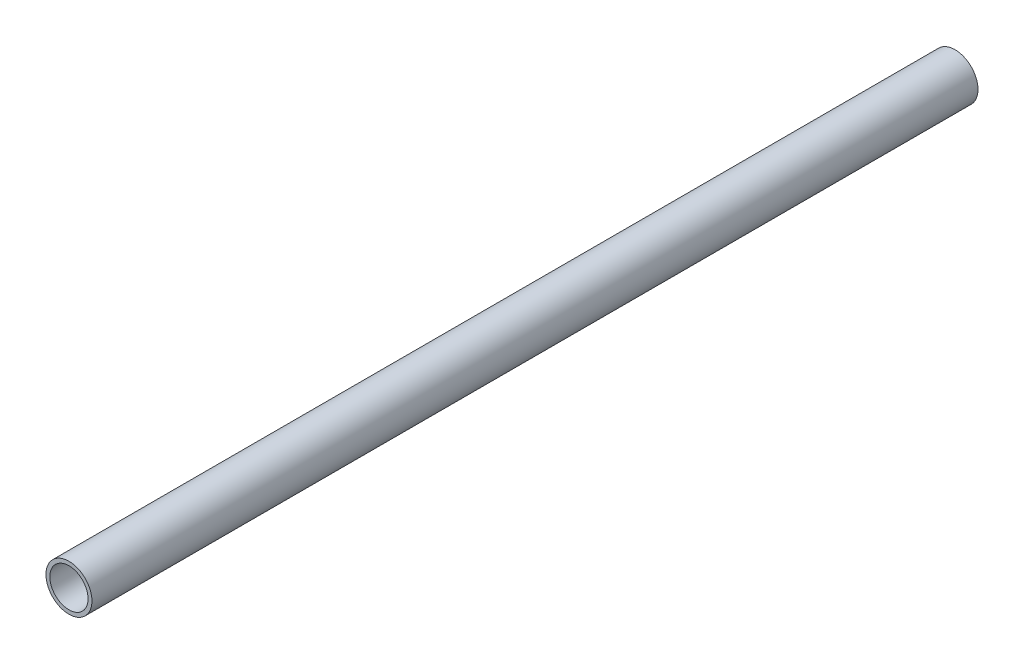
ISO-10303-21;
HEADER;
FILE_DESCRIPTION(('STEP AP214'),'2;1');
FILE_NAME('part.step','',(''),(''),'','','');
FILE_SCHEMA(('AUTOMOTIVE_DESIGN { 1 0 10303 214 1 1 1 1 }'));
ENDSEC;
DATA;
#1=APPLICATION_CONTEXT('core data for automotive mechanical design processes');
#2=APPLICATION_PROTOCOL_DEFINITION('international standard','automotive_design',2000,#1);
#3=PRODUCT_CONTEXT('',#1,'mechanical');
#4=PRODUCT('Part','Part','',(#3));
#5=PRODUCT_RELATED_PRODUCT_CATEGORY('part','',(#4));
#6=PRODUCT_DEFINITION_FORMATION('','',#4);
#7=PRODUCT_DEFINITION_CONTEXT('part definition',#1,'design');
#8=PRODUCT_DEFINITION('design','',#6,#7);
#9=PRODUCT_DEFINITION_SHAPE('','',#8);
#10=(LENGTH_UNIT() NAMED_UNIT(*) SI_UNIT(.MILLI.,.METRE.));
#11=(NAMED_UNIT(*) PLANE_ANGLE_UNIT() SI_UNIT($,.RADIAN.));
#12=(NAMED_UNIT(*) SI_UNIT($,.STERADIAN.) SOLID_ANGLE_UNIT());
#13=UNCERTAINTY_MEASURE_WITH_UNIT(LENGTH_MEASURE(1.E-05),#10,'distance_accuracy_value','');
#14=(GEOMETRIC_REPRESENTATION_CONTEXT(3) GLOBAL_UNCERTAINTY_ASSIGNED_CONTEXT((#13)) GLOBAL_UNIT_ASSIGNED_CONTEXT((#10,
#11,#12)) REPRESENTATION_CONTEXT('',''));
#15=CARTESIAN_POINT('',(0.,0.,0.));
#16=DIRECTION('',(0.,0.,1.));
#17=DIRECTION('',(1.,0.,0.));
#18=AXIS2_PLACEMENT_3D('',#15,#16,#17);
#19=CARTESIAN_POINT('',(0.,0.,-812.8));
#20=DIRECTION('',(0.,0.,1.));
#21=DIRECTION('',(1.,0.,0.));
#22=AXIS2_PLACEMENT_3D('',#19,#20,#21);
#23=CYLINDRICAL_SURFACE('',#22,21.082);
#24=CARTESIAN_POINT('',(0.,0.,-812.8));
#25=DIRECTION('',(0.,0.,1.));
#26=DIRECTION('',(1.,0.,0.));
#27=AXIS2_PLACEMENT_3D('',#24,#25,#26);
#28=CIRCLE('',#27,21.082);
#29=CARTESIAN_POINT('',(21.082,0.,-812.8));
#30=VERTEX_POINT('',#29);
#31=EDGE_CURVE('E10',#30,#30,#28,.T.);
#32=ORIENTED_EDGE('',*,*,#31,.T.);
#33=EDGE_LOOP('',(#32));
#34=FACE_BOUND('',#33,.T.);
#35=CARTESIAN_POINT('',(0.,0.,0.));
#36=DIRECTION('',(0.,0.,1.));
#37=DIRECTION('',(1.,0.,0.));
#38=AXIS2_PLACEMENT_3D('',#35,#36,#37);
#39=CIRCLE('',#38,21.082);
#40=CARTESIAN_POINT('',(21.082,0.,0.));
#41=VERTEX_POINT('',#40);
#42=EDGE_CURVE('E40',#41,#41,#39,.T.);
#43=ORIENTED_EDGE('',*,*,#42,.F.);
#44=EDGE_LOOP('',(#43));
#45=FACE_BOUND('',#44,.T.);
#46=ADVANCED_FACE('F37',(#34,#45),#23,.T.);
#47=CARTESIAN_POINT('',(0.,0.,-812.8));
#48=DIRECTION('',(0.,0.,1.));
#49=DIRECTION('',(1.,0.,0.));
#50=AXIS2_PLACEMENT_3D('',#47,#48,#49);
#51=PLANE('',#50);
#52=CARTESIAN_POINT('',(0.,0.,-812.8));
#53=DIRECTION('',(0.,0.,1.));
#54=DIRECTION('',(1.,0.,0.));
#55=AXIS2_PLACEMENT_3D('',#52,#53,#54);
#56=CIRCLE('',#55,17.526);
#57=CARTESIAN_POINT('',(17.526,0.,-812.8));
#58=VERTEX_POINT('',#57);
#59=EDGE_CURVE('E49',#58,#58,#56,.T.);
#60=ORIENTED_EDGE('',*,*,#59,.T.);
#61=EDGE_LOOP('',(#60));
#62=FACE_BOUND('',#61,.T.);
#63=ORIENTED_EDGE('',*,*,#31,.F.);
#64=EDGE_LOOP('',(#63));
#65=FACE_BOUND('',#64,.T.);
#66=ADVANCED_FACE('F59',(#62,#65),#51,.F.);
#67=CARTESIAN_POINT('',(0.,0.,0.));
#68=DIRECTION('',(0.,0.,1.));
#69=DIRECTION('',(1.,0.,0.));
#70=AXIS2_PLACEMENT_3D('',#67,#68,#69);
#71=PLANE('',#70);
#72=CARTESIAN_POINT('',(0.,0.,0.));
#73=DIRECTION('',(0.,0.,1.));
#74=DIRECTION('',(1.,0.,0.));
#75=AXIS2_PLACEMENT_3D('',#72,#73,#74);
#76=CIRCLE('',#75,17.526);
#77=CARTESIAN_POINT('',(17.526,0.,0.));
#78=VERTEX_POINT('',#77);
#79=EDGE_CURVE('E51',#78,#78,#76,.T.);
#80=ORIENTED_EDGE('',*,*,#79,.F.);
#81=EDGE_LOOP('',(#80));
#82=FACE_BOUND('',#81,.T.);
#83=ORIENTED_EDGE('',*,*,#42,.T.);
#84=EDGE_LOOP('',(#83));
#85=FACE_BOUND('',#84,.T.);
#86=ADVANCED_FACE('F65',(#82,#85),#71,.T.);
#87=CARTESIAN_POINT('',(0.,0.,-812.8));
#88=DIRECTION('',(0.,0.,1.));
#89=DIRECTION('',(1.,0.,0.));
#90=AXIS2_PLACEMENT_3D('',#87,#88,#89);
#91=CYLINDRICAL_SURFACE('',#90,17.526);
#92=ORIENTED_EDGE('',*,*,#59,.F.);
#93=EDGE_LOOP('',(#92));
#94=FACE_BOUND('',#93,.T.);
#95=ORIENTED_EDGE('',*,*,#79,.T.);
#96=EDGE_LOOP('',(#95));
#97=FACE_BOUND('',#96,.T.);
#98=ADVANCED_FACE('F62',(#94,#97),#91,.F.);
#99=CLOSED_SHELL('',(#46,#66,#86,#98));
#100=MANIFOLD_SOLID_BREP('B2',#99);
#101=ADVANCED_BREP_SHAPE_REPRESENTATION('',(#18,#100),#14);
#102=SHAPE_DEFINITION_REPRESENTATION(#9,#101);
ENDSEC;
END-ISO-10303-21;
